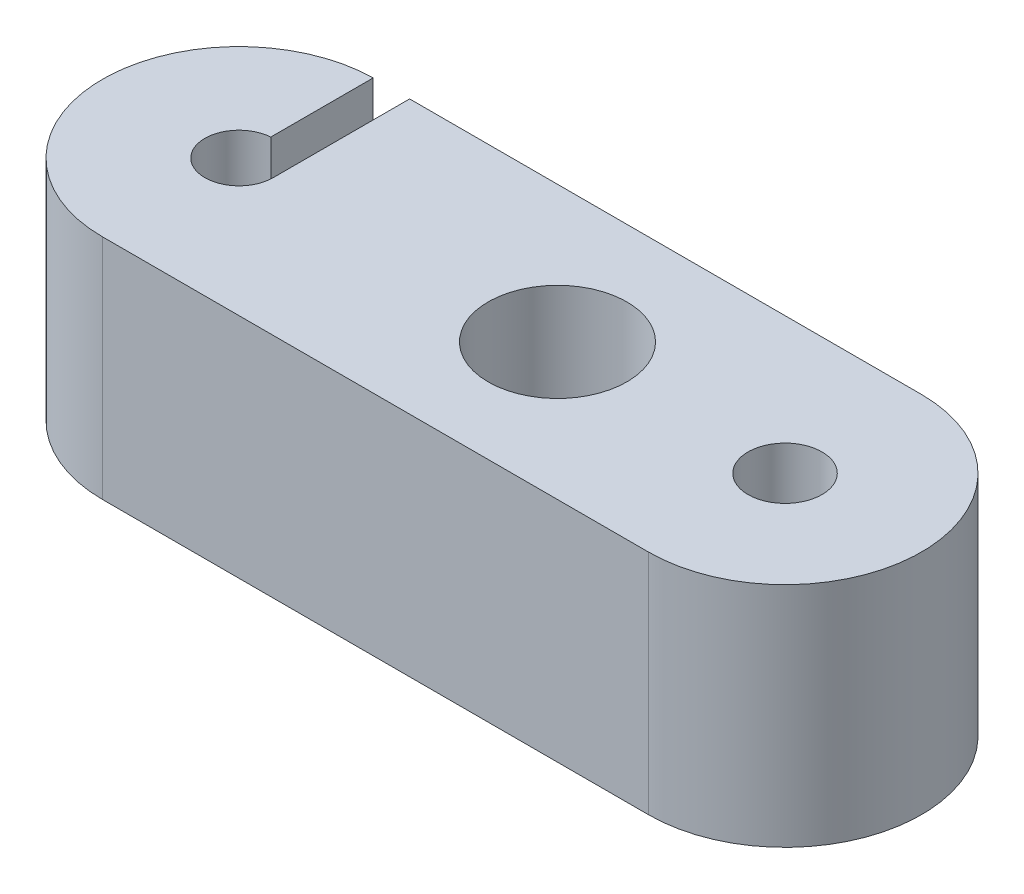
ISO-10303-21;
HEADER;
FILE_DESCRIPTION(('STEP AP214'),'2;1');
FILE_NAME('part.step','',(''),(''),'','','');
FILE_SCHEMA(('AUTOMOTIVE_DESIGN { 1 0 10303 214 1 1 1 1 }'));
ENDSEC;
DATA;
#1=APPLICATION_CONTEXT('core data for automotive mechanical design processes');
#2=APPLICATION_PROTOCOL_DEFINITION('international standard','automotive_design',2000,#1);
#3=PRODUCT_CONTEXT('',#1,'mechanical');
#4=PRODUCT('Part','Part','',(#3));
#5=PRODUCT_RELATED_PRODUCT_CATEGORY('part','',(#4));
#6=PRODUCT_DEFINITION_FORMATION('','',#4);
#7=PRODUCT_DEFINITION_CONTEXT('part definition',#1,'design');
#8=PRODUCT_DEFINITION('design','',#6,#7);
#9=PRODUCT_DEFINITION_SHAPE('','',#8);
#10=(LENGTH_UNIT() NAMED_UNIT(*) SI_UNIT(.MILLI.,.METRE.));
#11=(NAMED_UNIT(*) PLANE_ANGLE_UNIT() SI_UNIT($,.RADIAN.));
#12=(NAMED_UNIT(*) SI_UNIT($,.STERADIAN.) SOLID_ANGLE_UNIT());
#13=UNCERTAINTY_MEASURE_WITH_UNIT(LENGTH_MEASURE(1.E-05),#10,'distance_accuracy_value','');
#14=(GEOMETRIC_REPRESENTATION_CONTEXT(3) GLOBAL_UNCERTAINTY_ASSIGNED_CONTEXT((#13)) GLOBAL_UNIT_ASSIGNED_CONTEXT((#10,
#11,#12)) REPRESENTATION_CONTEXT('',''));
#15=CARTESIAN_POINT('',(0.,0.,0.));
#16=DIRECTION('',(0.,0.,1.));
#17=DIRECTION('',(1.,0.,0.));
#18=AXIS2_PLACEMENT_3D('',#15,#16,#17);
#19=CARTESIAN_POINT('',(-3.,2.5,0.));
#20=DIRECTION('',(0.,1.,0.));
#21=DIRECTION('',(0.,0.,1.));
#22=AXIS2_PLACEMENT_3D('',#19,#20,#21);
#23=PLANE('',#22);
#24=CARTESIAN_POINT('',(3.,2.5,0.));
#25=DIRECTION('',(0.,1.,0.));
#26=DIRECTION('',(0.,0.,1.));
#27=AXIS2_PLACEMENT_3D('',#24,#25,#26);
#28=CIRCLE('',#27,0.4064);
#29=CARTESIAN_POINT('',(3.,2.5,0.406399999999999));
#30=VERTEX_POINT('',#29);
#31=EDGE_CURVE('E111',#30,#30,#28,.T.);
#32=ORIENTED_EDGE('',*,*,#31,.F.);
#33=EDGE_LOOP('',(#32));
#34=FACE_BOUND('',#33,.T.);
#35=CARTESIAN_POINT('',(0.5,2.5,0.));
#36=DIRECTION('',(0.,1.,0.));
#37=DIRECTION('',(0.,0.,1.));
#38=AXIS2_PLACEMENT_3D('',#35,#36,#37);
#39=CIRCLE('',#38,0.762);
#40=CARTESIAN_POINT('',(0.5,2.5,0.762));
#41=VERTEX_POINT('',#40);
#42=EDGE_CURVE('E121',#41,#41,#39,.T.);
#43=ORIENTED_EDGE('',*,*,#42,.F.);
#44=EDGE_LOOP('',(#43));
#45=FACE_BOUND('',#44,.T.);
#46=DIRECTION('',(-1.,0.,0.));
#47=VECTOR('',#46,1.);
#48=CARTESIAN_POINT('',(-3.,2.5,-1.5));
#49=LINE('',#48,#47);
#50=CARTESIAN_POINT('',(3.,2.5,-1.5));
#51=VERTEX_POINT('',#50);
#52=CARTESIAN_POINT('',(-2.625,2.5,-1.5));
#53=VERTEX_POINT('',#52);
#54=EDGE_CURVE('E104',#51,#53,#49,.T.);
#55=ORIENTED_EDGE('',*,*,#54,.T.);
#56=DIRECTION('',(0.,0.,-1.));
#57=VECTOR('',#56,1.);
#58=CARTESIAN_POINT('',(-2.625,2.5,0.));
#59=LINE('',#58,#57);
#60=CARTESIAN_POINT('',(-2.625,2.5,0.));
#61=VERTEX_POINT('',#60);
#62=EDGE_CURVE('E91',#61,#53,#59,.T.);
#63=ORIENTED_EDGE('',*,*,#62,.F.);
#64=CARTESIAN_POINT('',(-3.,2.5,0.));
#65=DIRECTION('',(0.,1.,0.));
#66=DIRECTION('',(0.,0.,1.));
#67=AXIS2_PLACEMENT_3D('',#64,#65,#66);
#68=CIRCLE('',#67,0.375);
#69=CARTESIAN_POINT('',(-3.025,2.5,-0.374165738677395));
#70=VERTEX_POINT('',#69);
#71=EDGE_CURVE('E102',#70,#61,#68,.T.);
#72=ORIENTED_EDGE('',*,*,#71,.F.);
#73=DIRECTION('',(0.,0.,-1.));
#74=VECTOR('',#73,1.);
#75=CARTESIAN_POINT('',(-3.025,2.5,0.));
#76=LINE('',#75,#74);
#77=CARTESIAN_POINT('',(-3.025,2.5,-1.49979165219706));
#78=VERTEX_POINT('',#77);
#79=EDGE_CURVE('E55',#70,#78,#76,.T.);
#80=ORIENTED_EDGE('',*,*,#79,.T.);
#81=CARTESIAN_POINT('',(-3.,2.5,0.));
#82=DIRECTION('',(0.,1.,0.));
#83=DIRECTION('',(0.,0.,1.));
#84=AXIS2_PLACEMENT_3D('',#81,#82,#83);
#85=CIRCLE('',#84,1.5);
#86=CARTESIAN_POINT('',(-3.,2.5,1.5));
#87=VERTEX_POINT('',#86);
#88=EDGE_CURVE('E127',#78,#87,#85,.T.);
#89=ORIENTED_EDGE('',*,*,#88,.T.);
#90=DIRECTION('',(1.,0.,0.));
#91=VECTOR('',#90,1.);
#92=CARTESIAN_POINT('',(-3.,2.5,1.5));
#93=LINE('',#92,#91);
#94=CARTESIAN_POINT('',(3.,2.5,1.5));
#95=VERTEX_POINT('',#94);
#96=EDGE_CURVE('E129',#87,#95,#93,.T.);
#97=ORIENTED_EDGE('',*,*,#96,.T.);
#98=CARTESIAN_POINT('',(3.,2.5,0.));
#99=DIRECTION('',(0.,1.,0.));
#100=DIRECTION('',(0.,0.,1.));
#101=AXIS2_PLACEMENT_3D('',#98,#99,#100);
#102=CIRCLE('',#101,1.5);
#103=EDGE_CURVE('E132',#95,#51,#102,.T.);
#104=ORIENTED_EDGE('',*,*,#103,.T.);
#105=EDGE_LOOP('',(#55,#63,#72,#80,#89,#97,#104));
#106=FACE_BOUND('',#105,.T.);
#107=ADVANCED_FACE('F33',(#34,#45,#106),#23,.T.);
#108=CARTESIAN_POINT('',(-3.,0.,0.));
#109=DIRECTION('',(0.,1.,0.));
#110=DIRECTION('',(0.,0.,1.));
#111=AXIS2_PLACEMENT_3D('',#108,#109,#110);
#112=PLANE('',#111);
#113=CARTESIAN_POINT('',(3.,0.,0.));
#114=DIRECTION('',(0.,1.,0.));
#115=DIRECTION('',(0.,0.,1.));
#116=AXIS2_PLACEMENT_3D('',#113,#114,#115);
#117=CIRCLE('',#116,0.4064);
#118=CARTESIAN_POINT('',(3.,0.,0.406399999999999));
#119=VERTEX_POINT('',#118);
#120=EDGE_CURVE('E107',#119,#119,#117,.T.);
#121=ORIENTED_EDGE('',*,*,#120,.T.);
#122=EDGE_LOOP('',(#121));
#123=FACE_BOUND('',#122,.T.);
#124=CARTESIAN_POINT('',(0.5,0.,0.));
#125=DIRECTION('',(0.,1.,0.));
#126=DIRECTION('',(0.,0.,1.));
#127=AXIS2_PLACEMENT_3D('',#124,#125,#126);
#128=CIRCLE('',#127,0.762);
#129=CARTESIAN_POINT('',(0.5,0.,0.762));
#130=VERTEX_POINT('',#129);
#131=EDGE_CURVE('E119',#130,#130,#128,.T.);
#132=ORIENTED_EDGE('',*,*,#131,.T.);
#133=EDGE_LOOP('',(#132));
#134=FACE_BOUND('',#133,.T.);
#135=DIRECTION('',(0.,0.,-1.));
#136=VECTOR('',#135,1.);
#137=CARTESIAN_POINT('',(-2.625,0.,0.));
#138=LINE('',#137,#136);
#139=CARTESIAN_POINT('',(-2.625,0.,0.));
#140=VERTEX_POINT('',#139);
#141=CARTESIAN_POINT('',(-2.625,0.,-1.5));
#142=VERTEX_POINT('',#141);
#143=EDGE_CURVE('E48',#140,#142,#138,.T.);
#144=ORIENTED_EDGE('',*,*,#143,.T.);
#145=DIRECTION('',(-1.,0.,0.));
#146=VECTOR('',#145,1.);
#147=CARTESIAN_POINT('',(-3.,0.,-1.5));
#148=LINE('',#147,#146);
#149=CARTESIAN_POINT('',(3.,0.,-1.5));
#150=VERTEX_POINT('',#149);
#151=EDGE_CURVE('E130',#150,#142,#148,.T.);
#152=ORIENTED_EDGE('',*,*,#151,.F.);
#153=CARTESIAN_POINT('',(3.,0.,0.));
#154=DIRECTION('',(0.,1.,0.));
#155=DIRECTION('',(0.,0.,1.));
#156=AXIS2_PLACEMENT_3D('',#153,#154,#155);
#157=CIRCLE('',#156,1.5);
#158=CARTESIAN_POINT('',(3.,0.,1.5));
#159=VERTEX_POINT('',#158);
#160=EDGE_CURVE('E139',#159,#150,#157,.T.);
#161=ORIENTED_EDGE('',*,*,#160,.F.);
#162=DIRECTION('',(1.,0.,0.));
#163=VECTOR('',#162,1.);
#164=CARTESIAN_POINT('',(-3.,0.,1.5));
#165=LINE('',#164,#163);
#166=CARTESIAN_POINT('',(-3.,0.,1.5));
#167=VERTEX_POINT('',#166);
#168=EDGE_CURVE('E137',#167,#159,#165,.T.);
#169=ORIENTED_EDGE('',*,*,#168,.F.);
#170=CARTESIAN_POINT('',(-3.,0.,0.));
#171=DIRECTION('',(0.,1.,0.));
#172=DIRECTION('',(0.,0.,1.));
#173=AXIS2_PLACEMENT_3D('',#170,#171,#172);
#174=CIRCLE('',#173,1.5);
#175=CARTESIAN_POINT('',(-3.025,0.,-1.49979165219706));
#176=VERTEX_POINT('',#175);
#177=EDGE_CURVE('E124',#176,#167,#174,.T.);
#178=ORIENTED_EDGE('',*,*,#177,.F.);
#179=DIRECTION('',(0.,0.,-1.));
#180=VECTOR('',#179,1.);
#181=CARTESIAN_POINT('',(-3.025,0.,0.));
#182=LINE('',#181,#180);
#183=CARTESIAN_POINT('',(-3.025,0.,-0.374165738677395));
#184=VERTEX_POINT('',#183);
#185=EDGE_CURVE('E171',#184,#176,#182,.T.);
#186=ORIENTED_EDGE('',*,*,#185,.F.);
#187=CARTESIAN_POINT('',(-3.,0.,0.));
#188=DIRECTION('',(0.,1.,0.));
#189=DIRECTION('',(0.,0.,1.));
#190=AXIS2_PLACEMENT_3D('',#187,#188,#189);
#191=CIRCLE('',#190,0.375);
#192=EDGE_CURVE('E108',#184,#140,#191,.T.);
#193=ORIENTED_EDGE('',*,*,#192,.T.);
#194=EDGE_LOOP('',(#144,#152,#161,#169,#178,#186,#193));
#195=FACE_BOUND('',#194,.T.);
#196=ADVANCED_FACE('F161',(#123,#134,#195),#112,.F.);
#197=CARTESIAN_POINT('',(-3.,2.5,-1.5));
#198=DIRECTION('',(0.,0.,1.));
#199=DIRECTION('',(1.,0.,0.));
#200=AXIS2_PLACEMENT_3D('',#197,#198,#199);
#201=PLANE('',#200);
#202=DIRECTION('',(0.,-1.,0.));
#203=VECTOR('',#202,1.);
#204=CARTESIAN_POINT('',(-2.625,2.5,-1.5));
#205=LINE('',#204,#203);
#206=EDGE_CURVE('E113',#53,#142,#205,.T.);
#207=ORIENTED_EDGE('',*,*,#206,.F.);
#208=ORIENTED_EDGE('',*,*,#54,.F.);
#209=DIRECTION('',(0.,-1.,0.));
#210=VECTOR('',#209,1.);
#211=CARTESIAN_POINT('',(3.,2.5,-1.5));
#212=LINE('',#211,#210);
#213=EDGE_CURVE('E135',#51,#150,#212,.T.);
#214=ORIENTED_EDGE('',*,*,#213,.T.);
#215=ORIENTED_EDGE('',*,*,#151,.T.);
#216=EDGE_LOOP('',(#207,#208,#214,#215));
#217=FACE_BOUND('',#216,.T.);
#218=ADVANCED_FACE('F168',(#217),#201,.F.);
#219=CARTESIAN_POINT('',(-3.,2.5,0.));
#220=DIRECTION('',(0.,-1.,0.));
#221=DIRECTION('',(0.,0.,-1.));
#222=AXIS2_PLACEMENT_3D('',#219,#220,#221);
#223=CYLINDRICAL_SURFACE('',#222,0.375);
#224=ORIENTED_EDGE('',*,*,#71,.T.);
#225=DIRECTION('',(0.,-1.,0.));
#226=VECTOR('',#225,1.);
#227=CARTESIAN_POINT('',(-2.625,2.5,0.));
#228=LINE('',#227,#226);
#229=EDGE_CURVE('E88',#61,#140,#228,.T.);
#230=ORIENTED_EDGE('',*,*,#229,.T.);
#231=ORIENTED_EDGE('',*,*,#192,.F.);
#232=DIRECTION('',(0.,-1.,0.));
#233=VECTOR('',#232,1.);
#234=CARTESIAN_POINT('',(-3.025,2.5,-0.374165738677395));
#235=LINE('',#234,#233);
#236=EDGE_CURVE('E11',#70,#184,#235,.T.);
#237=ORIENTED_EDGE('',*,*,#236,.F.);
#238=EDGE_LOOP('',(#224,#230,#231,#237));
#239=FACE_BOUND('',#238,.T.);
#240=ADVANCED_FACE('F106',(#239),#223,.F.);
#241=CARTESIAN_POINT('',(-3.,2.5,0.));
#242=DIRECTION('',(0.,-1.,0.));
#243=DIRECTION('',(0.,0.,-1.));
#244=AXIS2_PLACEMENT_3D('',#241,#242,#243);
#245=CYLINDRICAL_SURFACE('',#244,1.5);
#246=ORIENTED_EDGE('',*,*,#88,.F.);
#247=DIRECTION('',(0.,-1.,0.));
#248=VECTOR('',#247,1.);
#249=CARTESIAN_POINT('',(-3.025,2.5,-1.49979165219706));
#250=LINE('',#249,#248);
#251=EDGE_CURVE('E97',#78,#176,#250,.T.);
#252=ORIENTED_EDGE('',*,*,#251,.T.);
#253=ORIENTED_EDGE('',*,*,#177,.T.);
#254=DIRECTION('',(0.,-1.,0.));
#255=VECTOR('',#254,1.);
#256=CARTESIAN_POINT('',(-3.,2.5,1.5));
#257=LINE('',#256,#255);
#258=EDGE_CURVE('E41',#87,#167,#257,.T.);
#259=ORIENTED_EDGE('',*,*,#258,.F.);
#260=EDGE_LOOP('',(#246,#252,#253,#259));
#261=FACE_BOUND('',#260,.T.);
#262=ADVANCED_FACE('F35',(#261),#245,.T.);
#263=CARTESIAN_POINT('',(-3.,2.5,1.5));
#264=DIRECTION('',(0.,0.,-1.));
#265=DIRECTION('',(-1.,0.,0.));
#266=AXIS2_PLACEMENT_3D('',#263,#264,#265);
#267=PLANE('',#266);
#268=ORIENTED_EDGE('',*,*,#168,.T.);
#269=DIRECTION('',(0.,-1.,0.));
#270=VECTOR('',#269,1.);
#271=CARTESIAN_POINT('',(3.,2.5,1.5));
#272=LINE('',#271,#270);
#273=EDGE_CURVE('E145',#95,#159,#272,.T.);
#274=ORIENTED_EDGE('',*,*,#273,.F.);
#275=ORIENTED_EDGE('',*,*,#96,.F.);
#276=ORIENTED_EDGE('',*,*,#258,.T.);
#277=EDGE_LOOP('',(#268,#274,#275,#276));
#278=FACE_BOUND('',#277,.T.);
#279=ADVANCED_FACE('F151',(#278),#267,.F.);
#280=CARTESIAN_POINT('',(3.,2.5,0.));
#281=DIRECTION('',(0.,-1.,0.));
#282=DIRECTION('',(0.,0.,-1.));
#283=AXIS2_PLACEMENT_3D('',#280,#281,#282);
#284=CYLINDRICAL_SURFACE('',#283,1.5);
#285=ORIENTED_EDGE('',*,*,#160,.T.);
#286=ORIENTED_EDGE('',*,*,#213,.F.);
#287=ORIENTED_EDGE('',*,*,#103,.F.);
#288=ORIENTED_EDGE('',*,*,#273,.T.);
#289=EDGE_LOOP('',(#285,#286,#287,#288));
#290=FACE_BOUND('',#289,.T.);
#291=ADVANCED_FACE('F165',(#290),#284,.T.);
#292=CARTESIAN_POINT('',(0.5,2.5,0.));
#293=DIRECTION('',(0.,-1.,0.));
#294=DIRECTION('',(0.,0.,-1.));
#295=AXIS2_PLACEMENT_3D('',#292,#293,#294);
#296=CYLINDRICAL_SURFACE('',#295,0.762);
#297=ORIENTED_EDGE('',*,*,#42,.T.);
#298=EDGE_LOOP('',(#297));
#299=FACE_BOUND('',#298,.T.);
#300=ORIENTED_EDGE('',*,*,#131,.F.);
#301=EDGE_LOOP('',(#300));
#302=FACE_BOUND('',#301,.T.);
#303=ADVANCED_FACE('F182',(#299,#302),#296,.F.);
#304=CARTESIAN_POINT('',(3.,2.5,0.));
#305=DIRECTION('',(0.,-1.,0.));
#306=DIRECTION('',(0.,0.,-1.));
#307=AXIS2_PLACEMENT_3D('',#304,#305,#306);
#308=CYLINDRICAL_SURFACE('',#307,0.4064);
#309=ORIENTED_EDGE('',*,*,#31,.T.);
#310=EDGE_LOOP('',(#309));
#311=FACE_BOUND('',#310,.T.);
#312=ORIENTED_EDGE('',*,*,#120,.F.);
#313=EDGE_LOOP('',(#312));
#314=FACE_BOUND('',#313,.T.);
#315=ADVANCED_FACE('F175',(#311,#314),#308,.F.);
#316=CARTESIAN_POINT('',(-3.025,2.5,0.));
#317=DIRECTION('',(-1.,0.,0.));
#318=DIRECTION('',(0.,0.,1.));
#319=AXIS2_PLACEMENT_3D('',#316,#317,#318);
#320=PLANE('',#319);
#321=ORIENTED_EDGE('',*,*,#79,.F.);
#322=ORIENTED_EDGE('',*,*,#236,.T.);
#323=ORIENTED_EDGE('',*,*,#185,.T.);
#324=ORIENTED_EDGE('',*,*,#251,.F.);
#325=EDGE_LOOP('',(#321,#322,#323,#324));
#326=FACE_BOUND('',#325,.T.);
#327=ADVANCED_FACE('F173',(#326),#320,.F.);
#328=CARTESIAN_POINT('',(-2.625,2.5,0.));
#329=DIRECTION('',(-1.,0.,0.));
#330=DIRECTION('',(0.,0.,1.));
#331=AXIS2_PLACEMENT_3D('',#328,#329,#330);
#332=PLANE('',#331);
#333=ORIENTED_EDGE('',*,*,#206,.T.);
#334=ORIENTED_EDGE('',*,*,#143,.F.);
#335=ORIENTED_EDGE('',*,*,#229,.F.);
#336=ORIENTED_EDGE('',*,*,#62,.T.);
#337=EDGE_LOOP('',(#333,#334,#335,#336));
#338=FACE_BOUND('',#337,.T.);
#339=ADVANCED_FACE('F90',(#338),#332,.T.);
#340=CLOSED_SHELL('',(#107,#196,#218,#240,#262,#279,#291,#303,#315,#327,#339));
#341=MANIFOLD_SOLID_BREP('B2',#340);
#342=ADVANCED_BREP_SHAPE_REPRESENTATION('',(#18,#341),#14);
#343=SHAPE_DEFINITION_REPRESENTATION(#9,#342);
ENDSEC;
END-ISO-10303-21;
